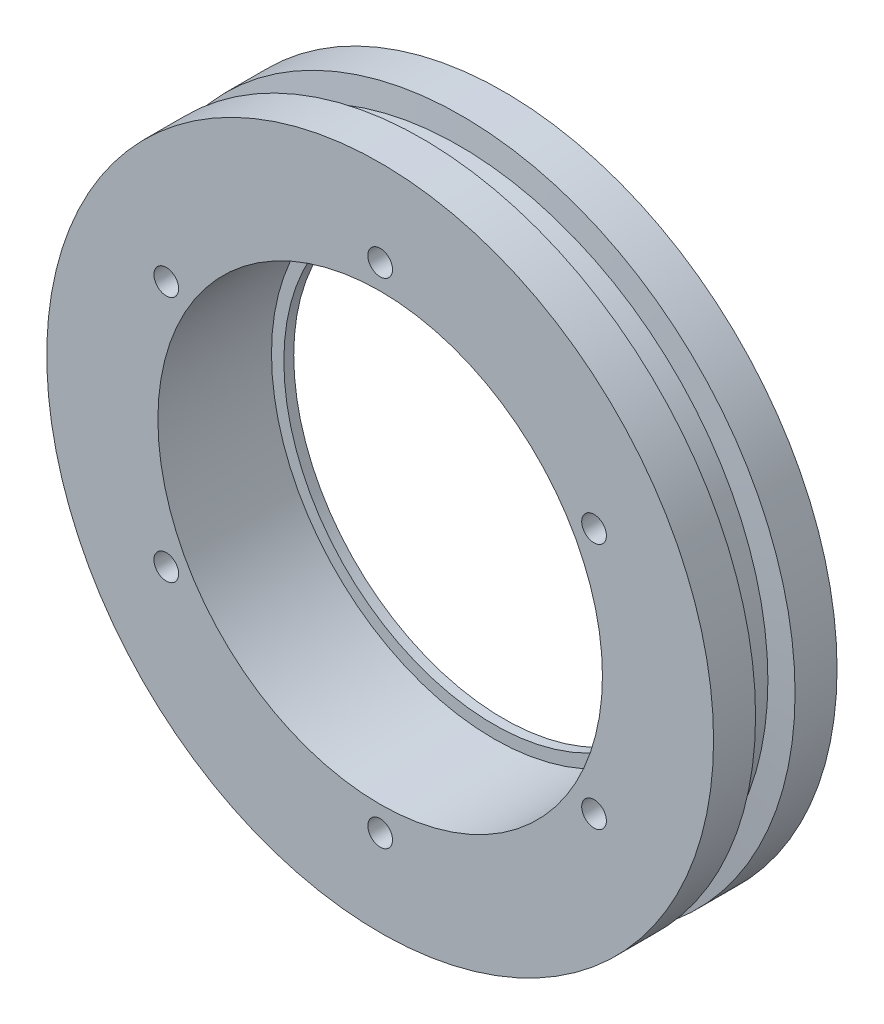
ISO-10303-21;
HEADER;
FILE_DESCRIPTION(('STEP AP214'),'2;1');
FILE_NAME('part.step','',(''),(''),'','','');
FILE_SCHEMA(('AUTOMOTIVE_DESIGN { 1 0 10303 214 1 1 1 1 }'));
ENDSEC;
DATA;
#1=APPLICATION_CONTEXT('core data for automotive mechanical design processes');
#2=APPLICATION_PROTOCOL_DEFINITION('international standard','automotive_design',2000,#1);
#3=PRODUCT_CONTEXT('',#1,'mechanical');
#4=PRODUCT('Part','Part','',(#3));
#5=PRODUCT_RELATED_PRODUCT_CATEGORY('part','',(#4));
#6=PRODUCT_DEFINITION_FORMATION('','',#4);
#7=PRODUCT_DEFINITION_CONTEXT('part definition',#1,'design');
#8=PRODUCT_DEFINITION('design','',#6,#7);
#9=PRODUCT_DEFINITION_SHAPE('','',#8);
#10=(LENGTH_UNIT() NAMED_UNIT(*) SI_UNIT(.MILLI.,.METRE.));
#11=(NAMED_UNIT(*) PLANE_ANGLE_UNIT() SI_UNIT($,.RADIAN.));
#12=(NAMED_UNIT(*) SI_UNIT($,.STERADIAN.) SOLID_ANGLE_UNIT());
#13=UNCERTAINTY_MEASURE_WITH_UNIT(LENGTH_MEASURE(1.E-05),#10,'distance_accuracy_value','');
#14=(GEOMETRIC_REPRESENTATION_CONTEXT(3) GLOBAL_UNCERTAINTY_ASSIGNED_CONTEXT((#13)) GLOBAL_UNIT_ASSIGNED_CONTEXT((#10,
#11,#12)) REPRESENTATION_CONTEXT('',''));
#15=CARTESIAN_POINT('',(0.,0.,0.));
#16=DIRECTION('',(0.,0.,1.));
#17=DIRECTION('',(1.,0.,0.));
#18=AXIS2_PLACEMENT_3D('',#15,#16,#17);
#19=CARTESIAN_POINT('',(0.,0.,0.));
#20=DIRECTION('',(0.,0.,1.));
#21=DIRECTION('',(1.,0.,0.));
#22=AXIS2_PLACEMENT_3D('',#19,#20,#21);
#23=CYLINDRICAL_SURFACE('',#22,67.5);
#24=CARTESIAN_POINT('',(0.,0.,-8.5));
#25=DIRECTION('',(0.,0.,1.));
#26=DIRECTION('',(1.,0.,0.));
#27=AXIS2_PLACEMENT_3D('',#24,#25,#26);
#28=CIRCLE('',#27,67.5);
#29=CARTESIAN_POINT('',(67.5,0.,-8.5));
#30=VERTEX_POINT('',#29);
#31=EDGE_CURVE('E80',#30,#30,#28,.T.);
#32=ORIENTED_EDGE('',*,*,#31,.T.);
#33=EDGE_LOOP('',(#32));
#34=FACE_BOUND('',#33,.T.);
#35=CARTESIAN_POINT('',(0.,0.,0.));
#36=DIRECTION('',(0.,0.,1.));
#37=DIRECTION('',(1.,0.,0.));
#38=AXIS2_PLACEMENT_3D('',#35,#36,#37);
#39=CIRCLE('',#38,67.5);
#40=CARTESIAN_POINT('',(67.5,0.,0.));
#41=VERTEX_POINT('',#40);
#42=EDGE_CURVE('E110',#41,#41,#39,.T.);
#43=ORIENTED_EDGE('',*,*,#42,.F.);
#44=EDGE_LOOP('',(#43));
#45=FACE_BOUND('',#44,.T.);
#46=ADVANCED_FACE('F36',(#34,#45),#23,.T.);
#47=CARTESIAN_POINT('',(67.5,0.,0.));
#48=DIRECTION('',(0.,0.,1.));
#49=DIRECTION('',(1.,0.,0.));
#50=AXIS2_PLACEMENT_3D('',#47,#48,#49);
#51=PLANE('',#50);
#52=CARTESIAN_POINT('',(-43.3012701892216,25.0000000000005,0.));
#53=DIRECTION('',(0.,0.,1.));
#54=DIRECTION('',(1.,0.,0.));
#55=AXIS2_PLACEMENT_3D('',#52,#53,#54);
#56=CIRCLE('',#55,2.5);
#57=CARTESIAN_POINT('',(-40.8012701892216,25.0000000000005,0.));
#58=VERTEX_POINT('',#57);
#59=EDGE_CURVE('E74',#58,#58,#56,.T.);
#60=ORIENTED_EDGE('',*,*,#59,.F.);
#61=EDGE_LOOP('',(#60));
#62=FACE_BOUND('',#61,.T.);
#63=CARTESIAN_POINT('',(-43.3012701892222,-24.9999999999996,0.));
#64=DIRECTION('',(0.,0.,1.));
#65=DIRECTION('',(1.,0.,0.));
#66=AXIS2_PLACEMENT_3D('',#63,#64,#65);
#67=CIRCLE('',#66,2.5);
#68=CARTESIAN_POINT('',(-40.8012701892222,-24.9999999999996,0.));
#69=VERTEX_POINT('',#68);
#70=EDGE_CURVE('E73',#69,#69,#67,.T.);
#71=ORIENTED_EDGE('',*,*,#70,.F.);
#72=EDGE_LOOP('',(#71));
#73=FACE_BOUND('',#72,.T.);
#74=CARTESIAN_POINT('',(0.,-50.,0.));
#75=DIRECTION('',(0.,0.,1.));
#76=DIRECTION('',(1.,0.,0.));
#77=AXIS2_PLACEMENT_3D('',#74,#75,#76);
#78=CIRCLE('',#77,2.5);
#79=CARTESIAN_POINT('',(2.5,-50.,0.));
#80=VERTEX_POINT('',#79);
#81=EDGE_CURVE('E86',#80,#80,#78,.T.);
#82=ORIENTED_EDGE('',*,*,#81,.F.);
#83=EDGE_LOOP('',(#82));
#84=FACE_BOUND('',#83,.T.);
#85=CARTESIAN_POINT('',(43.3012701892218,-25.0000000000002,0.));
#86=DIRECTION('',(0.,0.,1.));
#87=DIRECTION('',(1.,0.,0.));
#88=AXIS2_PLACEMENT_3D('',#85,#86,#87);
#89=CIRCLE('',#88,2.5);
#90=CARTESIAN_POINT('',(45.8012701892218,-25.0000000000002,0.));
#91=VERTEX_POINT('',#90);
#92=EDGE_CURVE('E92',#91,#91,#89,.T.);
#93=ORIENTED_EDGE('',*,*,#92,.F.);
#94=EDGE_LOOP('',(#93));
#95=FACE_BOUND('',#94,.T.);
#96=CARTESIAN_POINT('',(43.301270189222,24.9999999999999,0.));
#97=DIRECTION('',(0.,0.,1.));
#98=DIRECTION('',(1.,0.,0.));
#99=AXIS2_PLACEMENT_3D('',#96,#97,#98);
#100=CIRCLE('',#99,2.5);
#101=CARTESIAN_POINT('',(45.801270189222,24.9999999999999,0.));
#102=VERTEX_POINT('',#101);
#103=EDGE_CURVE('E98',#102,#102,#100,.T.);
#104=ORIENTED_EDGE('',*,*,#103,.F.);
#105=EDGE_LOOP('',(#104));
#106=FACE_BOUND('',#105,.T.);
#107=CARTESIAN_POINT('',(0.,50.,0.));
#108=DIRECTION('',(0.,0.,1.));
#109=DIRECTION('',(1.,0.,0.));
#110=AXIS2_PLACEMENT_3D('',#107,#108,#109);
#111=CIRCLE('',#110,2.5);
#112=CARTESIAN_POINT('',(2.5,50.,0.));
#113=VERTEX_POINT('',#112);
#114=EDGE_CURVE('E104',#113,#113,#111,.T.);
#115=ORIENTED_EDGE('',*,*,#114,.F.);
#116=EDGE_LOOP('',(#115));
#117=FACE_BOUND('',#116,.T.);
#118=ORIENTED_EDGE('',*,*,#42,.T.);
#119=EDGE_LOOP('',(#118));
#120=FACE_BOUND('',#119,.T.);
#121=CARTESIAN_POINT('',(0.,0.,0.));
#122=DIRECTION('',(0.,0.,1.));
#123=DIRECTION('',(1.,0.,0.));
#124=AXIS2_PLACEMENT_3D('',#121,#122,#123);
#125=CIRCLE('',#124,45.);
#126=CARTESIAN_POINT('',(45.,0.,0.));
#127=VERTEX_POINT('',#126);
#128=EDGE_CURVE('E11',#127,#127,#125,.T.);
#129=ORIENTED_EDGE('',*,*,#128,.F.);
#130=EDGE_LOOP('',(#129));
#131=FACE_BOUND('',#130,.T.);
#132=ADVANCED_FACE('F38',(#62,#73,#84,#95,#106,#117,#120,#131),#51,.T.);
#133=CARTESIAN_POINT('',(0.,0.,0.));
#134=DIRECTION('',(0.,0.,1.));
#135=DIRECTION('',(1.,0.,0.));
#136=AXIS2_PLACEMENT_3D('',#133,#134,#135);
#137=CYLINDRICAL_SURFACE('',#136,45.);
#138=ORIENTED_EDGE('',*,*,#128,.T.);
#139=EDGE_LOOP('',(#138));
#140=FACE_BOUND('',#139,.T.);
#141=CARTESIAN_POINT('',(0.,0.,-23.));
#142=DIRECTION('',(0.,0.,1.));
#143=DIRECTION('',(1.,0.,0.));
#144=AXIS2_PLACEMENT_3D('',#141,#142,#143);
#145=CIRCLE('',#144,45.);
#146=CARTESIAN_POINT('',(45.,0.,-23.));
#147=VERTEX_POINT('',#146);
#148=EDGE_CURVE('E44',#147,#147,#145,.T.);
#149=ORIENTED_EDGE('',*,*,#148,.F.);
#150=EDGE_LOOP('',(#149));
#151=FACE_BOUND('',#150,.T.);
#152=ADVANCED_FACE('F127',(#140,#151),#137,.F.);
#153=CARTESIAN_POINT('',(45.,0.,-23.));
#154=DIRECTION('',(0.,0.,1.));
#155=DIRECTION('',(1.,0.,0.));
#156=AXIS2_PLACEMENT_3D('',#153,#154,#155);
#157=PLANE('',#156);
#158=ORIENTED_EDGE('',*,*,#148,.T.);
#159=EDGE_LOOP('',(#158));
#160=FACE_BOUND('',#159,.T.);
#161=CARTESIAN_POINT('',(0.,0.,-23.));
#162=DIRECTION('',(0.,0.,1.));
#163=DIRECTION('',(1.,0.,0.));
#164=AXIS2_PLACEMENT_3D('',#161,#162,#163);
#165=CIRCLE('',#164,42.5);
#166=CARTESIAN_POINT('',(42.5,0.,-23.));
#167=VERTEX_POINT('',#166);
#168=EDGE_CURVE('E119',#167,#167,#165,.T.);
#169=ORIENTED_EDGE('',*,*,#168,.F.);
#170=EDGE_LOOP('',(#169));
#171=FACE_BOUND('',#170,.T.);
#172=ADVANCED_FACE('F124',(#160,#171),#157,.T.);
#173=CARTESIAN_POINT('',(0.,0.,0.));
#174=DIRECTION('',(0.,0.,1.));
#175=DIRECTION('',(1.,0.,0.));
#176=AXIS2_PLACEMENT_3D('',#173,#174,#175);
#177=CYLINDRICAL_SURFACE('',#176,42.5);
#178=ORIENTED_EDGE('',*,*,#168,.T.);
#179=EDGE_LOOP('',(#178));
#180=FACE_BOUND('',#179,.T.);
#181=CARTESIAN_POINT('',(0.,0.,-25.));
#182=DIRECTION('',(0.,0.,1.));
#183=DIRECTION('',(1.,0.,0.));
#184=AXIS2_PLACEMENT_3D('',#181,#182,#183);
#185=CIRCLE('',#184,42.5);
#186=CARTESIAN_POINT('',(42.5,0.,-25.));
#187=VERTEX_POINT('',#186);
#188=EDGE_CURVE('E116',#187,#187,#185,.T.);
#189=ORIENTED_EDGE('',*,*,#188,.F.);
#190=EDGE_LOOP('',(#189));
#191=FACE_BOUND('',#190,.T.);
#192=ADVANCED_FACE('F134',(#180,#191),#177,.F.);
#193=CARTESIAN_POINT('',(42.5,0.,-25.));
#194=DIRECTION('',(0.,0.,-1.));
#195=DIRECTION('',(-1.,0.,0.));
#196=AXIS2_PLACEMENT_3D('',#193,#194,#195);
#197=PLANE('',#196);
#198=ORIENTED_EDGE('',*,*,#188,.T.);
#199=EDGE_LOOP('',(#198));
#200=FACE_BOUND('',#199,.T.);
#201=CARTESIAN_POINT('',(0.,0.,-25.));
#202=DIRECTION('',(0.,0.,1.));
#203=DIRECTION('',(1.,0.,0.));
#204=AXIS2_PLACEMENT_3D('',#201,#202,#203);
#205=CIRCLE('',#204,67.5);
#206=CARTESIAN_POINT('',(67.5,0.,-25.));
#207=VERTEX_POINT('',#206);
#208=EDGE_CURVE('E113',#207,#207,#205,.T.);
#209=ORIENTED_EDGE('',*,*,#208,.F.);
#210=EDGE_LOOP('',(#209));
#211=FACE_BOUND('',#210,.T.);
#212=ADVANCED_FACE('F149',(#200,#211),#197,.T.);
#213=CARTESIAN_POINT('',(0.,0.,-16.5));
#214=DIRECTION('',(0.,0.,1.));
#215=DIRECTION('',(1.,0.,0.));
#216=AXIS2_PLACEMENT_3D('',#213,#214,#215);
#217=CIRCLE('',#216,67.5);
#218=CARTESIAN_POINT('',(67.5,0.,-16.5));
#219=VERTEX_POINT('',#218);
#220=EDGE_CURVE('E160',#219,#219,#217,.T.);
#221=ORIENTED_EDGE('',*,*,#220,.F.);
#222=EDGE_LOOP('',(#221));
#223=FACE_BOUND('',#222,.T.);
#224=ORIENTED_EDGE('',*,*,#208,.T.);
#225=EDGE_LOOP('',(#224));
#226=FACE_BOUND('',#225,.T.);
#227=ADVANCED_FACE('F140',(#223,#226),#23,.T.);
#228=CARTESIAN_POINT('',(0.,50.,-15.));
#229=DIRECTION('',(0.,0.,1.));
#230=DIRECTION('',(1.,0.,0.));
#231=AXIS2_PLACEMENT_3D('',#228,#229,#230);
#232=CONICAL_SURFACE('',#231,2.5,1.02974425867665);
#233=CARTESIAN_POINT('',(0.,50.,-16.5021515475689));
#234=VERTEX_POINT('',#233);
#235=VERTEX_LOOP('',#234);
#236=FACE_BOUND('',#235,.T.);
#237=CARTESIAN_POINT('',(0.,50.,-15.));
#238=DIRECTION('',(0.,0.,1.));
#239=DIRECTION('',(1.,0.,0.));
#240=AXIS2_PLACEMENT_3D('',#237,#238,#239);
#241=CIRCLE('',#240,2.5);
#242=CARTESIAN_POINT('',(2.5,50.,-15.));
#243=VERTEX_POINT('',#242);
#244=EDGE_CURVE('E107',#243,#243,#241,.T.);
#245=ORIENTED_EDGE('',*,*,#244,.T.);
#246=EDGE_LOOP('',(#245));
#247=FACE_BOUND('',#246,.T.);
#248=ADVANCED_FACE('F148',(#236,#247),#232,.F.);
#249=CARTESIAN_POINT('',(0.,50.,0.));
#250=DIRECTION('',(0.,0.,1.));
#251=DIRECTION('',(1.,0.,0.));
#252=AXIS2_PLACEMENT_3D('',#249,#250,#251);
#253=CYLINDRICAL_SURFACE('',#252,2.5);
#254=ORIENTED_EDGE('',*,*,#244,.F.);
#255=EDGE_LOOP('',(#254));
#256=FACE_BOUND('',#255,.T.);
#257=ORIENTED_EDGE('',*,*,#114,.T.);
#258=EDGE_LOOP('',(#257));
#259=FACE_BOUND('',#258,.T.);
#260=ADVANCED_FACE('F155',(#256,#259),#253,.F.);
#261=CARTESIAN_POINT('',(43.301270189222,24.9999999999999,-15.));
#262=DIRECTION('',(0.,0.,1.));
#263=DIRECTION('',(1.,0.,0.));
#264=AXIS2_PLACEMENT_3D('',#261,#262,#263);
#265=CONICAL_SURFACE('',#264,2.5,1.02974425867665);
#266=CARTESIAN_POINT('',(43.301270189222,24.9999999999999,-16.5021515475689));
#267=VERTEX_POINT('',#266);
#268=VERTEX_LOOP('',#267);
#269=FACE_BOUND('',#268,.T.);
#270=CARTESIAN_POINT('',(43.301270189222,24.9999999999999,-15.));
#271=DIRECTION('',(0.,0.,1.));
#272=DIRECTION('',(1.,0.,0.));
#273=AXIS2_PLACEMENT_3D('',#270,#271,#272);
#274=CIRCLE('',#273,2.5);
#275=CARTESIAN_POINT('',(45.801270189222,24.9999999999999,-15.));
#276=VERTEX_POINT('',#275);
#277=EDGE_CURVE('E101',#276,#276,#274,.T.);
#278=ORIENTED_EDGE('',*,*,#277,.T.);
#279=EDGE_LOOP('',(#278));
#280=FACE_BOUND('',#279,.T.);
#281=ADVANCED_FACE('F219',(#269,#280),#265,.F.);
#282=CARTESIAN_POINT('',(43.301270189222,24.9999999999999,0.));
#283=DIRECTION('',(0.,0.,1.));
#284=DIRECTION('',(1.,0.,0.));
#285=AXIS2_PLACEMENT_3D('',#282,#283,#284);
#286=CYLINDRICAL_SURFACE('',#285,2.5);
#287=ORIENTED_EDGE('',*,*,#277,.F.);
#288=EDGE_LOOP('',(#287));
#289=FACE_BOUND('',#288,.T.);
#290=ORIENTED_EDGE('',*,*,#103,.T.);
#291=EDGE_LOOP('',(#290));
#292=FACE_BOUND('',#291,.T.);
#293=ADVANCED_FACE('F215',(#289,#292),#286,.F.);
#294=CARTESIAN_POINT('',(43.3012701892218,-25.0000000000002,-15.));
#295=DIRECTION('',(0.,0.,1.));
#296=DIRECTION('',(1.,0.,0.));
#297=AXIS2_PLACEMENT_3D('',#294,#295,#296);
#298=CONICAL_SURFACE('',#297,2.5,1.02974425867665);
#299=CARTESIAN_POINT('',(43.3012701892218,-25.0000000000002,-16.5021515475689));
#300=VERTEX_POINT('',#299);
#301=VERTEX_LOOP('',#300);
#302=FACE_BOUND('',#301,.T.);
#303=CARTESIAN_POINT('',(43.3012701892218,-25.0000000000002,-15.));
#304=DIRECTION('',(0.,0.,1.));
#305=DIRECTION('',(1.,0.,0.));
#306=AXIS2_PLACEMENT_3D('',#303,#304,#305);
#307=CIRCLE('',#306,2.5);
#308=CARTESIAN_POINT('',(45.8012701892218,-25.0000000000002,-15.));
#309=VERTEX_POINT('',#308);
#310=EDGE_CURVE('E95',#309,#309,#307,.T.);
#311=ORIENTED_EDGE('',*,*,#310,.T.);
#312=EDGE_LOOP('',(#311));
#313=FACE_BOUND('',#312,.T.);
#314=ADVANCED_FACE('F211',(#302,#313),#298,.F.);
#315=CARTESIAN_POINT('',(43.3012701892218,-25.0000000000002,0.));
#316=DIRECTION('',(0.,0.,1.));
#317=DIRECTION('',(1.,0.,0.));
#318=AXIS2_PLACEMENT_3D('',#315,#316,#317);
#319=CYLINDRICAL_SURFACE('',#318,2.5);
#320=ORIENTED_EDGE('',*,*,#310,.F.);
#321=EDGE_LOOP('',(#320));
#322=FACE_BOUND('',#321,.T.);
#323=ORIENTED_EDGE('',*,*,#92,.T.);
#324=EDGE_LOOP('',(#323));
#325=FACE_BOUND('',#324,.T.);
#326=ADVANCED_FACE('F207',(#322,#325),#319,.F.);
#327=CARTESIAN_POINT('',(0.,-50.,-15.));
#328=DIRECTION('',(0.,0.,1.));
#329=DIRECTION('',(1.,0.,0.));
#330=AXIS2_PLACEMENT_3D('',#327,#328,#329);
#331=CONICAL_SURFACE('',#330,2.5,1.02974425867665);
#332=CARTESIAN_POINT('',(0.,-50.,-16.5021515475689));
#333=VERTEX_POINT('',#332);
#334=VERTEX_LOOP('',#333);
#335=FACE_BOUND('',#334,.T.);
#336=CARTESIAN_POINT('',(0.,-50.,-15.));
#337=DIRECTION('',(0.,0.,1.));
#338=DIRECTION('',(1.,0.,0.));
#339=AXIS2_PLACEMENT_3D('',#336,#337,#338);
#340=CIRCLE('',#339,2.5);
#341=CARTESIAN_POINT('',(2.5,-50.,-15.));
#342=VERTEX_POINT('',#341);
#343=EDGE_CURVE('E89',#342,#342,#340,.T.);
#344=ORIENTED_EDGE('',*,*,#343,.T.);
#345=EDGE_LOOP('',(#344));
#346=FACE_BOUND('',#345,.T.);
#347=ADVANCED_FACE('F203',(#335,#346),#331,.F.);
#348=CARTESIAN_POINT('',(0.,-50.,0.));
#349=DIRECTION('',(0.,0.,1.));
#350=DIRECTION('',(1.,0.,0.));
#351=AXIS2_PLACEMENT_3D('',#348,#349,#350);
#352=CYLINDRICAL_SURFACE('',#351,2.5);
#353=ORIENTED_EDGE('',*,*,#343,.F.);
#354=EDGE_LOOP('',(#353));
#355=FACE_BOUND('',#354,.T.);
#356=ORIENTED_EDGE('',*,*,#81,.T.);
#357=EDGE_LOOP('',(#356));
#358=FACE_BOUND('',#357,.T.);
#359=ADVANCED_FACE('F199',(#355,#358),#352,.F.);
#360=CARTESIAN_POINT('',(-43.3012701892222,-24.9999999999996,-15.));
#361=DIRECTION('',(0.,0.,1.));
#362=DIRECTION('',(1.,0.,0.));
#363=AXIS2_PLACEMENT_3D('',#360,#361,#362);
#364=CONICAL_SURFACE('',#363,2.5,1.02974425867665);
#365=CARTESIAN_POINT('',(-43.3012701892222,-24.9999999999996,-16.5021515475689));
#366=VERTEX_POINT('',#365);
#367=VERTEX_LOOP('',#366);
#368=FACE_BOUND('',#367,.T.);
#369=CARTESIAN_POINT('',(-43.3012701892222,-24.9999999999996,-15.));
#370=DIRECTION('',(0.,0.,1.));
#371=DIRECTION('',(1.,0.,0.));
#372=AXIS2_PLACEMENT_3D('',#369,#370,#371);
#373=CIRCLE('',#372,2.5);
#374=CARTESIAN_POINT('',(-40.8012701892222,-24.9999999999996,-15.));
#375=VERTEX_POINT('',#374);
#376=EDGE_CURVE('E77',#375,#375,#373,.T.);
#377=ORIENTED_EDGE('',*,*,#376,.T.);
#378=EDGE_LOOP('',(#377));
#379=FACE_BOUND('',#378,.T.);
#380=ADVANCED_FACE('F195',(#368,#379),#364,.F.);
#381=CARTESIAN_POINT('',(-43.3012701892222,-24.9999999999996,0.));
#382=DIRECTION('',(0.,0.,1.));
#383=DIRECTION('',(1.,0.,0.));
#384=AXIS2_PLACEMENT_3D('',#381,#382,#383);
#385=CYLINDRICAL_SURFACE('',#384,2.5);
#386=ORIENTED_EDGE('',*,*,#376,.F.);
#387=EDGE_LOOP('',(#386));
#388=FACE_BOUND('',#387,.T.);
#389=ORIENTED_EDGE('',*,*,#70,.T.);
#390=EDGE_LOOP('',(#389));
#391=FACE_BOUND('',#390,.T.);
#392=ADVANCED_FACE('F67',(#388,#391),#385,.F.);
#393=CARTESIAN_POINT('',(-43.3012701892216,25.0000000000005,-15.));
#394=DIRECTION('',(0.,0.,1.));
#395=DIRECTION('',(1.,0.,0.));
#396=AXIS2_PLACEMENT_3D('',#393,#394,#395);
#397=CONICAL_SURFACE('',#396,2.5,1.02974425867665);
#398=CARTESIAN_POINT('',(-43.3012701892216,25.0000000000005,-16.5021515475689));
#399=VERTEX_POINT('',#398);
#400=VERTEX_LOOP('',#399);
#401=FACE_BOUND('',#400,.T.);
#402=CARTESIAN_POINT('',(-43.3012701892216,25.0000000000005,-15.));
#403=DIRECTION('',(0.,0.,1.));
#404=DIRECTION('',(1.,0.,0.));
#405=AXIS2_PLACEMENT_3D('',#402,#403,#404);
#406=CIRCLE('',#405,2.5);
#407=CARTESIAN_POINT('',(-40.8012701892216,25.0000000000005,-15.));
#408=VERTEX_POINT('',#407);
#409=EDGE_CURVE('E71',#408,#408,#406,.T.);
#410=ORIENTED_EDGE('',*,*,#409,.T.);
#411=EDGE_LOOP('',(#410));
#412=FACE_BOUND('',#411,.T.);
#413=ADVANCED_FACE('F63',(#401,#412),#397,.F.);
#414=CARTESIAN_POINT('',(-43.3012701892216,25.0000000000005,0.));
#415=DIRECTION('',(0.,0.,1.));
#416=DIRECTION('',(1.,0.,0.));
#417=AXIS2_PLACEMENT_3D('',#414,#415,#416);
#418=CYLINDRICAL_SURFACE('',#417,2.5);
#419=ORIENTED_EDGE('',*,*,#409,.F.);
#420=EDGE_LOOP('',(#419));
#421=FACE_BOUND('',#420,.T.);
#422=ORIENTED_EDGE('',*,*,#59,.T.);
#423=EDGE_LOOP('',(#422));
#424=FACE_BOUND('',#423,.T.);
#425=ADVANCED_FACE('F66',(#421,#424),#418,.F.);
#426=CARTESIAN_POINT('',(0.,0.,-9.));
#427=DIRECTION('',(0.,0.,1.));
#428=DIRECTION('',(1.,0.,0.));
#429=AXIS2_PLACEMENT_3D('',#426,#427,#428);
#430=CONICAL_SURFACE('',#429,62.5,1.47112767430373);
#431=ORIENTED_EDGE('',*,*,#31,.F.);
#432=EDGE_LOOP('',(#431));
#433=FACE_BOUND('',#432,.T.);
#434=CARTESIAN_POINT('',(0.,0.,-9.));
#435=DIRECTION('',(0.,0.,1.));
#436=DIRECTION('',(1.,0.,0.));
#437=AXIS2_PLACEMENT_3D('',#434,#435,#436);
#438=CIRCLE('',#437,62.5);
#439=CARTESIAN_POINT('',(62.5,0.,-9.));
#440=VERTEX_POINT('',#439);
#441=EDGE_CURVE('E167',#440,#440,#438,.T.);
#442=ORIENTED_EDGE('',*,*,#441,.T.);
#443=EDGE_LOOP('',(#442));
#444=FACE_BOUND('',#443,.T.);
#445=ADVANCED_FACE('F173',(#433,#444),#430,.T.);
#446=CARTESIAN_POINT('',(0.,0.,0.));
#447=DIRECTION('',(0.,0.,1.));
#448=DIRECTION('',(1.,0.,0.));
#449=AXIS2_PLACEMENT_3D('',#446,#447,#448);
#450=CYLINDRICAL_SURFACE('',#449,62.5);
#451=ORIENTED_EDGE('',*,*,#441,.F.);
#452=EDGE_LOOP('',(#451));
#453=FACE_BOUND('',#452,.T.);
#454=CARTESIAN_POINT('',(0.,0.,-16.));
#455=DIRECTION('',(0.,0.,1.));
#456=DIRECTION('',(1.,0.,0.));
#457=AXIS2_PLACEMENT_3D('',#454,#455,#456);
#458=CIRCLE('',#457,62.5);
#459=CARTESIAN_POINT('',(62.5,0.,-16.));
#460=VERTEX_POINT('',#459);
#461=EDGE_CURVE('E164',#460,#460,#458,.T.);
#462=ORIENTED_EDGE('',*,*,#461,.T.);
#463=EDGE_LOOP('',(#462));
#464=FACE_BOUND('',#463,.T.);
#465=ADVANCED_FACE('F176',(#453,#464),#450,.T.);
#466=CARTESIAN_POINT('',(0.,0.,-16.5));
#467=DIRECTION('',(0.,0.,-1.));
#468=DIRECTION('',(-1.,0.,0.));
#469=AXIS2_PLACEMENT_3D('',#466,#467,#468);
#470=CONICAL_SURFACE('',#469,67.5,1.47112767430373);
#471=ORIENTED_EDGE('',*,*,#461,.F.);
#472=EDGE_LOOP('',(#471));
#473=FACE_BOUND('',#472,.T.);
#474=ORIENTED_EDGE('',*,*,#220,.T.);
#475=EDGE_LOOP('',(#474));
#476=FACE_BOUND('',#475,.T.);
#477=ADVANCED_FACE('F182',(#473,#476),#470,.T.);
#478=CLOSED_SHELL('',(#46,#132,#152,#172,#192,#212,#227,#248,#260,#281,#293,#314,#326,#347,#359,
#380,#392,#413,#425,#445,#465,#477));
#479=MANIFOLD_SOLID_BREP('B2',#478);
#480=ADVANCED_BREP_SHAPE_REPRESENTATION('',(#18,#479),#14);
#481=SHAPE_DEFINITION_REPRESENTATION(#9,#480);
ENDSEC;
END-ISO-10303-21;
